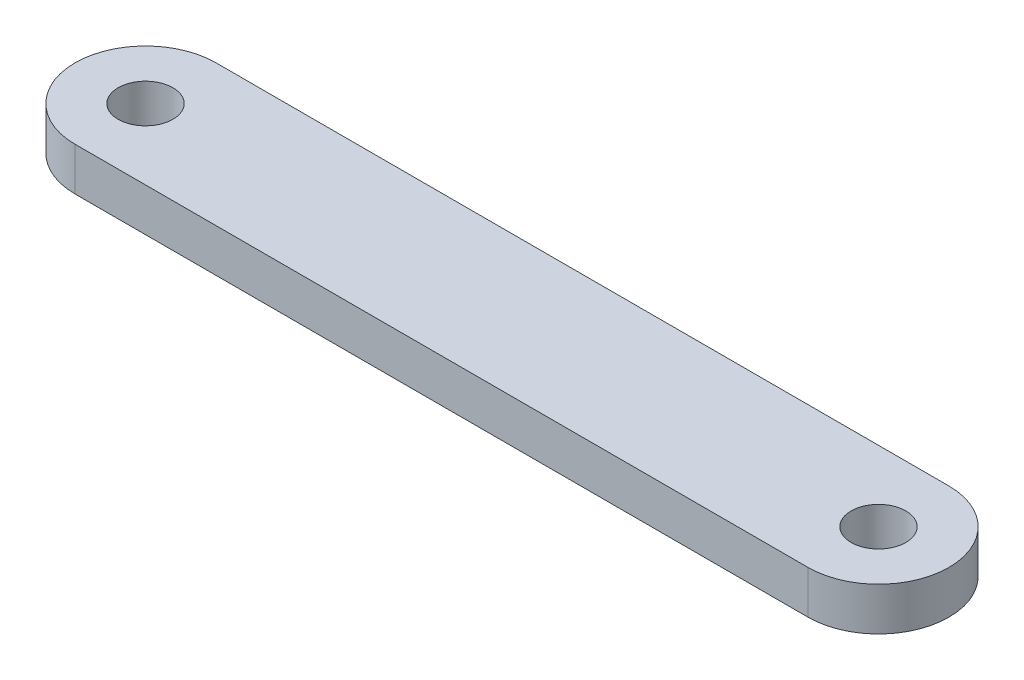
ISO-10303-21;
HEADER;
FILE_DESCRIPTION(('STEP AP214'),'2;1');
FILE_NAME('part.step','',(''),(''),'','','');
FILE_SCHEMA(('AUTOMOTIVE_DESIGN { 1 0 10303 214 1 1 1 1 }'));
ENDSEC;
DATA;
#1=APPLICATION_CONTEXT('core data for automotive mechanical design processes');
#2=APPLICATION_PROTOCOL_DEFINITION('international standard','automotive_design',2000,#1);
#3=PRODUCT_CONTEXT('',#1,'mechanical');
#4=PRODUCT('Part','Part','',(#3));
#5=PRODUCT_RELATED_PRODUCT_CATEGORY('part','',(#4));
#6=PRODUCT_DEFINITION_FORMATION('','',#4);
#7=PRODUCT_DEFINITION_CONTEXT('part definition',#1,'design');
#8=PRODUCT_DEFINITION('design','',#6,#7);
#9=PRODUCT_DEFINITION_SHAPE('','',#8);
#10=(LENGTH_UNIT() NAMED_UNIT(*) SI_UNIT(.MILLI.,.METRE.));
#11=(NAMED_UNIT(*) PLANE_ANGLE_UNIT() SI_UNIT($,.RADIAN.));
#12=(NAMED_UNIT(*) SI_UNIT($,.STERADIAN.) SOLID_ANGLE_UNIT());
#13=UNCERTAINTY_MEASURE_WITH_UNIT(LENGTH_MEASURE(1.E-05),#10,'distance_accuracy_value','');
#14=(GEOMETRIC_REPRESENTATION_CONTEXT(3) GLOBAL_UNCERTAINTY_ASSIGNED_CONTEXT((#13)) GLOBAL_UNIT_ASSIGNED_CONTEXT((#10,
#11,#12)) REPRESENTATION_CONTEXT('',''));
#15=CARTESIAN_POINT('',(0.,0.,0.));
#16=DIRECTION('',(0.,0.,1.));
#17=DIRECTION('',(1.,0.,0.));
#18=AXIS2_PLACEMENT_3D('',#15,#16,#17);
#19=CARTESIAN_POINT('',(-95.1125042689552,0.,-12.108497355039));
#20=DIRECTION('',(0.,1.,0.));
#21=DIRECTION('',(0.,0.,1.));
#22=AXIS2_PLACEMENT_3D('',#19,#20,#21);
#23=CYLINDRICAL_SURFACE('',#22,8.17499999999999);
#24=CARTESIAN_POINT('',(-95.1125042689552,5.,-12.108497355039));
#25=DIRECTION('',(0.,1.,0.));
#26=DIRECTION('',(0.,0.,1.));
#27=AXIS2_PLACEMENT_3D('',#24,#25,#26);
#28=CIRCLE('',#27,8.17499999999999);
#29=CARTESIAN_POINT('',(-95.1125042689552,5.,-20.283497355039));
#30=VERTEX_POINT('',#29);
#31=CARTESIAN_POINT('',(-95.1125042689552,5.,-3.93349735503902));
#32=VERTEX_POINT('',#31);
#33=EDGE_CURVE('E98',#30,#32,#28,.T.);
#34=ORIENTED_EDGE('',*,*,#33,.F.);
#35=DIRECTION('',(0.,1.,0.));
#36=VECTOR('',#35,1.);
#37=CARTESIAN_POINT('',(-95.1125042689552,0.,-20.283497355039));
#38=LINE('',#37,#36);
#39=CARTESIAN_POINT('',(-95.1125042689552,0.,-20.283497355039));
#40=VERTEX_POINT('',#39);
#41=EDGE_CURVE('E11',#40,#30,#38,.T.);
#42=ORIENTED_EDGE('',*,*,#41,.F.);
#43=CARTESIAN_POINT('',(-95.1125042689552,0.,-12.108497355039));
#44=DIRECTION('',(0.,1.,0.));
#45=DIRECTION('',(0.,0.,1.));
#46=AXIS2_PLACEMENT_3D('',#43,#44,#45);
#47=CIRCLE('',#46,8.17499999999999);
#48=CARTESIAN_POINT('',(-95.1125042689552,0.,-3.93349735503902));
#49=VERTEX_POINT('',#48);
#50=EDGE_CURVE('E91',#40,#49,#47,.T.);
#51=ORIENTED_EDGE('',*,*,#50,.T.);
#52=DIRECTION('',(0.,1.,0.));
#53=VECTOR('',#52,1.);
#54=CARTESIAN_POINT('',(-95.1125042689552,0.,-3.93349735503902));
#55=LINE('',#54,#53);
#56=EDGE_CURVE('E36',#49,#32,#55,.T.);
#57=ORIENTED_EDGE('',*,*,#56,.T.);
#58=EDGE_LOOP('',(#34,#42,#51,#57));
#59=FACE_BOUND('',#58,.T.);
#60=ADVANCED_FACE('F33',(#59),#23,.T.);
#61=CARTESIAN_POINT('',(-10.1125042689552,0.,-20.283497355039));
#62=DIRECTION('',(0.,0.,-1.));
#63=DIRECTION('',(-1.,0.,0.));
#64=AXIS2_PLACEMENT_3D('',#61,#62,#63);
#65=PLANE('',#64);
#66=DIRECTION('',(-1.,0.,0.));
#67=VECTOR('',#66,1.);
#68=CARTESIAN_POINT('',(-10.1125042689552,5.,-20.283497355039));
#69=LINE('',#68,#67);
#70=CARTESIAN_POINT('',(-10.1125042689552,5.,-20.283497355039));
#71=VERTEX_POINT('',#70);
#72=EDGE_CURVE('E93',#71,#30,#69,.T.);
#73=ORIENTED_EDGE('',*,*,#72,.F.);
#74=DIRECTION('',(0.,1.,0.));
#75=VECTOR('',#74,1.);
#76=CARTESIAN_POINT('',(-10.1125042689552,0.,-20.283497355039));
#77=LINE('',#76,#75);
#78=CARTESIAN_POINT('',(-10.1125042689552,0.,-20.283497355039));
#79=VERTEX_POINT('',#78);
#80=EDGE_CURVE('E42',#79,#71,#77,.T.);
#81=ORIENTED_EDGE('',*,*,#80,.F.);
#82=DIRECTION('',(-1.,0.,0.));
#83=VECTOR('',#82,1.);
#84=CARTESIAN_POINT('',(-10.1125042689552,0.,-20.283497355039));
#85=LINE('',#84,#83);
#86=EDGE_CURVE('E88',#79,#40,#85,.T.);
#87=ORIENTED_EDGE('',*,*,#86,.T.);
#88=ORIENTED_EDGE('',*,*,#41,.T.);
#89=EDGE_LOOP('',(#73,#81,#87,#88));
#90=FACE_BOUND('',#89,.T.);
#91=ADVANCED_FACE('F109',(#90),#65,.T.);
#92=CARTESIAN_POINT('',(-10.1125042689552,0.,-12.108497355039));
#93=DIRECTION('',(0.,1.,0.));
#94=DIRECTION('',(0.,0.,1.));
#95=AXIS2_PLACEMENT_3D('',#92,#93,#94);
#96=CYLINDRICAL_SURFACE('',#95,8.175);
#97=CARTESIAN_POINT('',(-10.1125042689552,5.,-12.108497355039));
#98=DIRECTION('',(0.,1.,0.));
#99=DIRECTION('',(0.,0.,1.));
#100=AXIS2_PLACEMENT_3D('',#97,#98,#99);
#101=CIRCLE('',#100,8.175);
#102=CARTESIAN_POINT('',(-10.1125042689552,5.,-3.933497355039));
#103=VERTEX_POINT('',#102);
#104=EDGE_CURVE('E83',#103,#71,#101,.T.);
#105=ORIENTED_EDGE('',*,*,#104,.F.);
#106=DIRECTION('',(0.,1.,0.));
#107=VECTOR('',#106,1.);
#108=CARTESIAN_POINT('',(-10.1125042689552,0.,-3.933497355039));
#109=LINE('',#108,#107);
#110=CARTESIAN_POINT('',(-10.1125042689552,0.,-3.933497355039));
#111=VERTEX_POINT('',#110);
#112=EDGE_CURVE('E78',#111,#103,#109,.T.);
#113=ORIENTED_EDGE('',*,*,#112,.F.);
#114=CARTESIAN_POINT('',(-10.1125042689552,0.,-12.108497355039));
#115=DIRECTION('',(0.,1.,0.));
#116=DIRECTION('',(0.,0.,1.));
#117=AXIS2_PLACEMENT_3D('',#114,#115,#116);
#118=CIRCLE('',#117,8.175);
#119=EDGE_CURVE('E81',#111,#79,#118,.T.);
#120=ORIENTED_EDGE('',*,*,#119,.T.);
#121=ORIENTED_EDGE('',*,*,#80,.T.);
#122=EDGE_LOOP('',(#105,#113,#120,#121));
#123=FACE_BOUND('',#122,.T.);
#124=ADVANCED_FACE('F80',(#123),#96,.T.);
#125=CARTESIAN_POINT('',(-95.1125042689552,0.,-3.93349735503902));
#126=DIRECTION('',(0.,0.,1.));
#127=DIRECTION('',(1.,0.,0.));
#128=AXIS2_PLACEMENT_3D('',#125,#126,#127);
#129=PLANE('',#128);
#130=DIRECTION('',(1.,0.,0.));
#131=VECTOR('',#130,1.);
#132=CARTESIAN_POINT('',(-95.1125042689552,5.,-3.93349735503902));
#133=LINE('',#132,#131);
#134=EDGE_CURVE('E101',#32,#103,#133,.T.);
#135=ORIENTED_EDGE('',*,*,#134,.F.);
#136=ORIENTED_EDGE('',*,*,#56,.F.);
#137=DIRECTION('',(1.,0.,0.));
#138=VECTOR('',#137,1.);
#139=CARTESIAN_POINT('',(-95.1125042689552,0.,-3.93349735503902));
#140=LINE('',#139,#138);
#141=EDGE_CURVE('E87',#49,#111,#140,.T.);
#142=ORIENTED_EDGE('',*,*,#141,.T.);
#143=ORIENTED_EDGE('',*,*,#112,.T.);
#144=EDGE_LOOP('',(#135,#136,#142,#143));
#145=FACE_BOUND('',#144,.T.);
#146=ADVANCED_FACE('F90',(#145),#129,.T.);
#147=CARTESIAN_POINT('',(-95.1125042689552,0.,-12.108497355039));
#148=DIRECTION('',(0.,1.,0.));
#149=DIRECTION('',(0.,0.,1.));
#150=AXIS2_PLACEMENT_3D('',#147,#148,#149);
#151=PLANE('',#150);
#152=CARTESIAN_POINT('',(-10.1125042689552,0.,-12.108497355039));
#153=DIRECTION('',(0.,1.,0.));
#154=DIRECTION('',(0.,0.,-1.));
#155=AXIS2_PLACEMENT_3D('',#152,#153,#154);
#156=CIRCLE('',#155,3.175);
#157=CARTESIAN_POINT('',(-10.1125042689552,0.,-15.283497355039));
#158=VERTEX_POINT('',#157);
#159=EDGE_CURVE('E142',#158,#158,#156,.T.);
#160=ORIENTED_EDGE('',*,*,#159,.T.);
#161=EDGE_LOOP('',(#160));
#162=FACE_BOUND('',#161,.T.);
#163=CARTESIAN_POINT('',(-95.1125042689552,0.,-12.108497355039));
#164=DIRECTION('',(0.,1.,0.));
#165=DIRECTION('',(0.,0.,-1.));
#166=AXIS2_PLACEMENT_3D('',#163,#164,#165);
#167=CIRCLE('',#166,3.175);
#168=CARTESIAN_POINT('',(-95.1125042689552,0.,-15.283497355039));
#169=VERTEX_POINT('',#168);
#170=EDGE_CURVE('E102',#169,#169,#167,.T.);
#171=ORIENTED_EDGE('',*,*,#170,.T.);
#172=EDGE_LOOP('',(#171));
#173=FACE_BOUND('',#172,.T.);
#174=ORIENTED_EDGE('',*,*,#50,.F.);
#175=ORIENTED_EDGE('',*,*,#86,.F.);
#176=ORIENTED_EDGE('',*,*,#119,.F.);
#177=ORIENTED_EDGE('',*,*,#141,.F.);
#178=EDGE_LOOP('',(#174,#175,#176,#177));
#179=FACE_BOUND('',#178,.T.);
#180=ADVANCED_FACE('F86',(#162,#173,#179),#151,.F.);
#181=CARTESIAN_POINT('',(-95.1125042689552,5.,-12.108497355039));
#182=DIRECTION('',(0.,1.,0.));
#183=DIRECTION('',(0.,0.,1.));
#184=AXIS2_PLACEMENT_3D('',#181,#182,#183);
#185=PLANE('',#184);
#186=CARTESIAN_POINT('',(-10.1125042689552,5.,-12.108497355039));
#187=DIRECTION('',(0.,1.,0.));
#188=DIRECTION('',(0.,0.,-1.));
#189=AXIS2_PLACEMENT_3D('',#186,#187,#188);
#190=CIRCLE('',#189,3.175);
#191=CARTESIAN_POINT('',(-10.1125042689552,5.,-15.283497355039));
#192=VERTEX_POINT('',#191);
#193=EDGE_CURVE('E145',#192,#192,#190,.T.);
#194=ORIENTED_EDGE('',*,*,#193,.F.);
#195=EDGE_LOOP('',(#194));
#196=FACE_BOUND('',#195,.T.);
#197=CARTESIAN_POINT('',(-95.1125042689552,5.,-12.108497355039));
#198=DIRECTION('',(0.,1.,0.));
#199=DIRECTION('',(0.,0.,-1.));
#200=AXIS2_PLACEMENT_3D('',#197,#198,#199);
#201=CIRCLE('',#200,3.175);
#202=CARTESIAN_POINT('',(-95.1125042689552,5.,-15.283497355039));
#203=VERTEX_POINT('',#202);
#204=EDGE_CURVE('E147',#203,#203,#201,.T.);
#205=ORIENTED_EDGE('',*,*,#204,.F.);
#206=EDGE_LOOP('',(#205));
#207=FACE_BOUND('',#206,.T.);
#208=ORIENTED_EDGE('',*,*,#33,.T.);
#209=ORIENTED_EDGE('',*,*,#134,.T.);
#210=ORIENTED_EDGE('',*,*,#104,.T.);
#211=ORIENTED_EDGE('',*,*,#72,.T.);
#212=EDGE_LOOP('',(#208,#209,#210,#211));
#213=FACE_BOUND('',#212,.T.);
#214=ADVANCED_FACE('F108',(#196,#207,#213),#185,.T.);
#215=CARTESIAN_POINT('',(-95.1125042689552,0.,-12.108497355039));
#216=DIRECTION('',(0.,1.,0.));
#217=DIRECTION('',(0.,0.,1.));
#218=AXIS2_PLACEMENT_3D('',#215,#216,#217);
#219=CYLINDRICAL_SURFACE('',#218,3.175);
#220=ORIENTED_EDGE('',*,*,#170,.F.);
#221=EDGE_LOOP('',(#220));
#222=FACE_BOUND('',#221,.T.);
#223=ORIENTED_EDGE('',*,*,#204,.T.);
#224=EDGE_LOOP('',(#223));
#225=FACE_BOUND('',#224,.T.);
#226=ADVANCED_FACE('F127',(#222,#225),#219,.F.);
#227=CARTESIAN_POINT('',(-10.1125042689552,0.,-12.108497355039));
#228=DIRECTION('',(0.,1.,0.));
#229=DIRECTION('',(0.,0.,1.));
#230=AXIS2_PLACEMENT_3D('',#227,#228,#229);
#231=CYLINDRICAL_SURFACE('',#230,3.175);
#232=ORIENTED_EDGE('',*,*,#159,.F.);
#233=EDGE_LOOP('',(#232));
#234=FACE_BOUND('',#233,.T.);
#235=ORIENTED_EDGE('',*,*,#193,.T.);
#236=EDGE_LOOP('',(#235));
#237=FACE_BOUND('',#236,.T.);
#238=ADVANCED_FACE('F134',(#234,#237),#231,.F.);
#239=CLOSED_SHELL('',(#60,#91,#124,#146,#180,#214,#226,#238));
#240=MANIFOLD_SOLID_BREP('B2',#239);
#241=ADVANCED_BREP_SHAPE_REPRESENTATION('',(#18,#240),#14);
#242=SHAPE_DEFINITION_REPRESENTATION(#9,#241);
ENDSEC;
END-ISO-10303-21;
